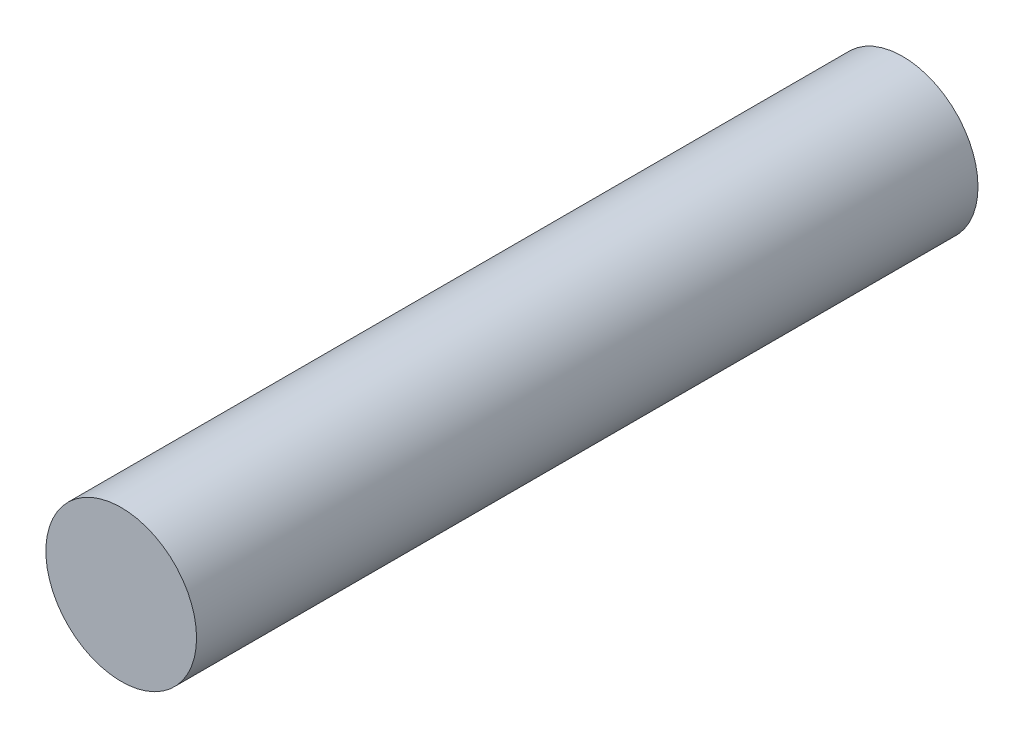
ISO-10303-21;
HEADER;
FILE_DESCRIPTION(('STEP AP214'),'2;1');
FILE_NAME('part.step','',(''),(''),'','','');
FILE_SCHEMA(('AUTOMOTIVE_DESIGN { 1 0 10303 214 1 1 1 1 }'));
ENDSEC;
DATA;
#1=APPLICATION_CONTEXT('core data for automotive mechanical design processes');
#2=APPLICATION_PROTOCOL_DEFINITION('international standard','automotive_design',2000,#1);
#3=PRODUCT_CONTEXT('',#1,'mechanical');
#4=PRODUCT('Part','Part','',(#3));
#5=PRODUCT_RELATED_PRODUCT_CATEGORY('part','',(#4));
#6=PRODUCT_DEFINITION_FORMATION('','',#4);
#7=PRODUCT_DEFINITION_CONTEXT('part definition',#1,'design');
#8=PRODUCT_DEFINITION('design','',#6,#7);
#9=PRODUCT_DEFINITION_SHAPE('','',#8);
#10=(LENGTH_UNIT() NAMED_UNIT(*) SI_UNIT(.MILLI.,.METRE.));
#11=(NAMED_UNIT(*) PLANE_ANGLE_UNIT() SI_UNIT($,.RADIAN.));
#12=(NAMED_UNIT(*) SI_UNIT($,.STERADIAN.) SOLID_ANGLE_UNIT());
#13=UNCERTAINTY_MEASURE_WITH_UNIT(LENGTH_MEASURE(1.E-05),#10,'distance_accuracy_value','');
#14=(GEOMETRIC_REPRESENTATION_CONTEXT(3) GLOBAL_UNCERTAINTY_ASSIGNED_CONTEXT((#13)) GLOBAL_UNIT_ASSIGNED_CONTEXT((#10,
#11,#12)) REPRESENTATION_CONTEXT('',''));
#15=CARTESIAN_POINT('',(0.,0.,0.));
#16=DIRECTION('',(0.,0.,1.));
#17=DIRECTION('',(1.,0.,0.));
#18=AXIS2_PLACEMENT_3D('',#15,#16,#17);
#19=CARTESIAN_POINT('',(0.,0.,14.));
#20=DIRECTION('',(0.,0.,-1.));
#21=DIRECTION('',(-1.,0.,0.));
#22=AXIS2_PLACEMENT_3D('',#19,#20,#21);
#23=CYLINDRICAL_SURFACE('',#22,1.35);
#24=CARTESIAN_POINT('',(0.,0.,14.));
#25=DIRECTION('',(0.,0.,1.));
#26=DIRECTION('',(1.,0.,0.));
#27=AXIS2_PLACEMENT_3D('',#24,#25,#26);
#28=CIRCLE('',#27,1.35);
#29=CARTESIAN_POINT('',(1.35,0.,14.));
#30=VERTEX_POINT('',#29);
#31=EDGE_CURVE('E10',#30,#30,#28,.T.);
#32=ORIENTED_EDGE('',*,*,#31,.F.);
#33=EDGE_LOOP('',(#32));
#34=FACE_BOUND('',#33,.T.);
#35=CARTESIAN_POINT('',(0.,0.,0.));
#36=DIRECTION('',(0.,0.,1.));
#37=DIRECTION('',(1.,0.,0.));
#38=AXIS2_PLACEMENT_3D('',#35,#36,#37);
#39=CIRCLE('',#38,1.35);
#40=CARTESIAN_POINT('',(1.35,0.,0.));
#41=VERTEX_POINT('',#40);
#42=EDGE_CURVE('E38',#41,#41,#39,.T.);
#43=ORIENTED_EDGE('',*,*,#42,.T.);
#44=EDGE_LOOP('',(#43));
#45=FACE_BOUND('',#44,.T.);
#46=ADVANCED_FACE('F35',(#34,#45),#23,.T.);
#47=CARTESIAN_POINT('',(0.,0.,14.));
#48=DIRECTION('',(0.,0.,1.));
#49=DIRECTION('',(1.,0.,0.));
#50=AXIS2_PLACEMENT_3D('',#47,#48,#49);
#51=PLANE('',#50);
#52=ORIENTED_EDGE('',*,*,#31,.T.);
#53=EDGE_LOOP('',(#52));
#54=FACE_BOUND('',#53,.T.);
#55=ADVANCED_FACE('F50',(#54),#51,.T.);
#56=CARTESIAN_POINT('',(0.,0.,0.));
#57=DIRECTION('',(0.,0.,1.));
#58=DIRECTION('',(1.,0.,0.));
#59=AXIS2_PLACEMENT_3D('',#56,#57,#58);
#60=PLANE('',#59);
#61=ORIENTED_EDGE('',*,*,#42,.F.);
#62=EDGE_LOOP('',(#61));
#63=FACE_BOUND('',#62,.T.);
#64=ADVANCED_FACE('F48',(#63),#60,.F.);
#65=CLOSED_SHELL('',(#46,#55,#64));
#66=MANIFOLD_SOLID_BREP('B2',#65);
#67=ADVANCED_BREP_SHAPE_REPRESENTATION('',(#18,#66),#14);
#68=SHAPE_DEFINITION_REPRESENTATION(#9,#67);
ENDSEC;
END-ISO-10303-21;
